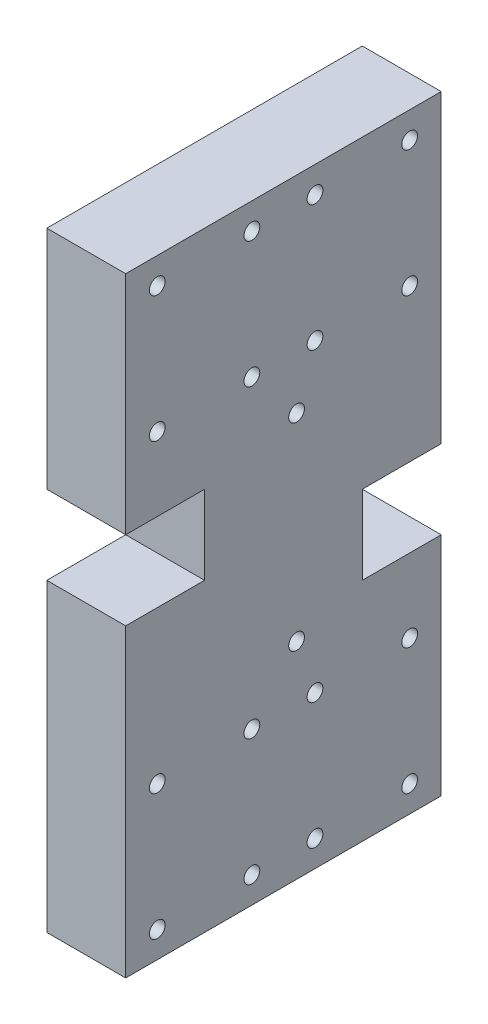
ISO-10303-21;
HEADER;
FILE_DESCRIPTION(('STEP AP214'),'2;1');
FILE_NAME('part.step','',(''),(''),'','','');
FILE_SCHEMA(('AUTOMOTIVE_DESIGN { 1 0 10303 214 1 1 1 1 }'));
ENDSEC;
DATA;
#1=APPLICATION_CONTEXT('core data for automotive mechanical design processes');
#2=APPLICATION_PROTOCOL_DEFINITION('international standard','automotive_design',2000,#1);
#3=PRODUCT_CONTEXT('',#1,'mechanical');
#4=PRODUCT('Part','Part','',(#3));
#5=PRODUCT_RELATED_PRODUCT_CATEGORY('part','',(#4));
#6=PRODUCT_DEFINITION_FORMATION('','',#4);
#7=PRODUCT_DEFINITION_CONTEXT('part definition',#1,'design');
#8=PRODUCT_DEFINITION('design','',#6,#7);
#9=PRODUCT_DEFINITION_SHAPE('','',#8);
#10=(LENGTH_UNIT() NAMED_UNIT(*) SI_UNIT(.MILLI.,.METRE.));
#11=(NAMED_UNIT(*) PLANE_ANGLE_UNIT() SI_UNIT($,.RADIAN.));
#12=(NAMED_UNIT(*) SI_UNIT($,.STERADIAN.) SOLID_ANGLE_UNIT());
#13=UNCERTAINTY_MEASURE_WITH_UNIT(LENGTH_MEASURE(1.E-05),#10,'distance_accuracy_value','');
#14=(GEOMETRIC_REPRESENTATION_CONTEXT(3) GLOBAL_UNCERTAINTY_ASSIGNED_CONTEXT((#13)) GLOBAL_UNIT_ASSIGNED_CONTEXT((#10,
#11,#12)) REPRESENTATION_CONTEXT('',''));
#15=CARTESIAN_POINT('',(0.,0.,0.));
#16=DIRECTION('',(0.,0.,1.));
#17=DIRECTION('',(1.,0.,0.));
#18=AXIS2_PLACEMENT_3D('',#15,#16,#17);
#19=CARTESIAN_POINT('',(15.,0.,-60.));
#20=DIRECTION('',(0.,0.,1.));
#21=DIRECTION('',(1.,0.,0.));
#22=AXIS2_PLACEMENT_3D('',#19,#20,#21);
#23=PLANE('',#22);
#24=DIRECTION('',(0.,1.,0.));
#25=VECTOR('',#24,1.);
#26=CARTESIAN_POINT('',(0.,0.,-60.));
#27=LINE('',#26,#25);
#28=CARTESIAN_POINT('',(0.,0.,-60.));
#29=VERTEX_POINT('',#28);
#30=CARTESIAN_POINT('',(0.,43.,-60.));
#31=VERTEX_POINT('',#30);
#32=EDGE_CURVE('E308',#29,#31,#27,.T.);
#33=ORIENTED_EDGE('',*,*,#32,.T.);
#34=DIRECTION('',(1.,0.,0.));
#35=VECTOR('',#34,1.);
#36=CARTESIAN_POINT('',(0.,43.,-60.));
#37=LINE('',#36,#35);
#38=CARTESIAN_POINT('',(15.,43.,-60.));
#39=VERTEX_POINT('',#38);
#40=EDGE_CURVE('E152',#31,#39,#37,.T.);
#41=ORIENTED_EDGE('',*,*,#40,.T.);
#42=DIRECTION('',(0.,1.,0.));
#43=VECTOR('',#42,1.);
#44=CARTESIAN_POINT('',(15.,0.,-60.));
#45=LINE('',#44,#43);
#46=CARTESIAN_POINT('',(15.,0.,-60.));
#47=VERTEX_POINT('',#46);
#48=EDGE_CURVE('E297',#47,#39,#45,.T.);
#49=ORIENTED_EDGE('',*,*,#48,.F.);
#50=DIRECTION('',(-1.,0.,0.));
#51=VECTOR('',#50,1.);
#52=CARTESIAN_POINT('',(15.,0.,-60.));
#53=LINE('',#52,#51);
#54=EDGE_CURVE('E41',#47,#29,#53,.T.);
#55=ORIENTED_EDGE('',*,*,#54,.T.);
#56=EDGE_LOOP('',(#33,#41,#49,#55));
#57=FACE_BOUND('',#56,.T.);
#58=ADVANCED_FACE('F33',(#57),#23,.F.);
#59=CARTESIAN_POINT('',(15.,0.,0.));
#60=DIRECTION('',(0.,0.,-1.));
#61=DIRECTION('',(-1.,0.,0.));
#62=AXIS2_PLACEMENT_3D('',#59,#60,#61);
#63=PLANE('',#62);
#64=DIRECTION('',(0.,-1.,0.));
#65=VECTOR('',#64,1.);
#66=CARTESIAN_POINT('',(0.,0.,0.));
#67=LINE('',#66,#65);
#68=CARTESIAN_POINT('',(0.,116.,0.));
#69=VERTEX_POINT('',#68);
#70=CARTESIAN_POINT('',(0.,73.,0.));
#71=VERTEX_POINT('',#70);
#72=EDGE_CURVE('E303',#69,#71,#67,.T.);
#73=ORIENTED_EDGE('',*,*,#72,.T.);
#74=DIRECTION('',(1.,0.,0.));
#75=VECTOR('',#74,1.);
#76=CARTESIAN_POINT('',(0.,73.,0.));
#77=LINE('',#76,#75);
#78=CARTESIAN_POINT('',(15.,73.,0.));
#79=VERTEX_POINT('',#78);
#80=EDGE_CURVE('E173',#71,#79,#77,.T.);
#81=ORIENTED_EDGE('',*,*,#80,.T.);
#82=DIRECTION('',(0.,-1.,0.));
#83=VECTOR('',#82,1.);
#84=CARTESIAN_POINT('',(15.,0.,0.));
#85=LINE('',#84,#83);
#86=CARTESIAN_POINT('',(15.,116.,0.));
#87=VERTEX_POINT('',#86);
#88=EDGE_CURVE('E290',#87,#79,#85,.T.);
#89=ORIENTED_EDGE('',*,*,#88,.F.);
#90=DIRECTION('',(-1.,0.,0.));
#91=VECTOR('',#90,1.);
#92=CARTESIAN_POINT('',(15.,116.,0.));
#93=LINE('',#92,#91);
#94=EDGE_CURVE('E302',#87,#69,#93,.T.);
#95=ORIENTED_EDGE('',*,*,#94,.T.);
#96=EDGE_LOOP('',(#73,#81,#89,#95));
#97=FACE_BOUND('',#96,.T.);
#98=ADVANCED_FACE('F348',(#97),#63,.F.);
#99=CARTESIAN_POINT('',(15.,0.,0.));
#100=DIRECTION('',(-1.,0.,0.));
#101=DIRECTION('',(0.,0.,1.));
#102=AXIS2_PLACEMENT_3D('',#99,#100,#101);
#103=PLANE('',#102);
#104=CARTESIAN_POINT('',(15.,76.8,-32.5));
#105=DIRECTION('',(1.,0.,0.));
#106=DIRECTION('',(0.,0.,-1.));
#107=AXIS2_PLACEMENT_3D('',#104,#105,#106);
#108=CIRCLE('',#107,1.5);
#109=CARTESIAN_POINT('',(15.,76.8,-34.));
#110=VERTEX_POINT('',#109);
#111=EDGE_CURVE('E188',#110,#110,#108,.T.);
#112=ORIENTED_EDGE('',*,*,#111,.F.);
#113=EDGE_LOOP('',(#112));
#114=FACE_BOUND('',#113,.T.);
#115=CARTESIAN_POINT('',(15.,111.,-54.));
#116=DIRECTION('',(1.,0.,0.));
#117=DIRECTION('',(0.,0.,1.));
#118=AXIS2_PLACEMENT_3D('',#115,#116,#117);
#119=CIRCLE('',#118,1.5);
#120=CARTESIAN_POINT('',(15.,111.,-52.5));
#121=VERTEX_POINT('',#120);
#122=EDGE_CURVE('E200',#121,#121,#119,.T.);
#123=ORIENTED_EDGE('',*,*,#122,.F.);
#124=EDGE_LOOP('',(#123));
#125=FACE_BOUND('',#124,.T.);
#126=CARTESIAN_POINT('',(15.,87.,-36.));
#127=DIRECTION('',(1.,0.,0.));
#128=DIRECTION('',(0.,0.,1.));
#129=AXIS2_PLACEMENT_3D('',#126,#127,#128);
#130=CIRCLE('',#129,1.5);
#131=CARTESIAN_POINT('',(15.,87.,-34.5));
#132=VERTEX_POINT('',#131);
#133=EDGE_CURVE('E212',#132,#132,#130,.T.);
#134=ORIENTED_EDGE('',*,*,#133,.F.);
#135=EDGE_LOOP('',(#134));
#136=FACE_BOUND('',#135,.T.);
#137=CARTESIAN_POINT('',(15.,111.,-24.));
#138=DIRECTION('',(1.,0.,0.));
#139=DIRECTION('',(0.,0.,-1.));
#140=AXIS2_PLACEMENT_3D('',#137,#138,#139);
#141=CIRCLE('',#140,1.5);
#142=CARTESIAN_POINT('',(15.,111.,-25.5));
#143=VERTEX_POINT('',#142);
#144=EDGE_CURVE('E224',#143,#143,#141,.T.);
#145=ORIENTED_EDGE('',*,*,#144,.F.);
#146=EDGE_LOOP('',(#145));
#147=FACE_BOUND('',#146,.T.);
#148=CARTESIAN_POINT('',(15.,87.,-6.));
#149=DIRECTION('',(1.,0.,0.));
#150=DIRECTION('',(0.,0.,-1.));
#151=AXIS2_PLACEMENT_3D('',#148,#149,#150);
#152=CIRCLE('',#151,1.5);
#153=CARTESIAN_POINT('',(15.,87.,-7.5));
#154=VERTEX_POINT('',#153);
#155=EDGE_CURVE('E236',#154,#154,#152,.T.);
#156=ORIENTED_EDGE('',*,*,#155,.F.);
#157=EDGE_LOOP('',(#156));
#158=FACE_BOUND('',#157,.T.);
#159=CARTESIAN_POINT('',(15.,5.,-6.));
#160=DIRECTION('',(1.,0.,0.));
#161=DIRECTION('',(0.,0.,1.));
#162=AXIS2_PLACEMENT_3D('',#159,#160,#161);
#163=CIRCLE('',#162,1.5);
#164=CARTESIAN_POINT('',(15.,5.,-4.49999999999999));
#165=VERTEX_POINT('',#164);
#166=EDGE_CURVE('E248',#165,#165,#163,.T.);
#167=ORIENTED_EDGE('',*,*,#166,.F.);
#168=EDGE_LOOP('',(#167));
#169=FACE_BOUND('',#168,.T.);
#170=CARTESIAN_POINT('',(15.,29.,-24.));
#171=DIRECTION('',(1.,0.,0.));
#172=DIRECTION('',(0.,0.,1.));
#173=AXIS2_PLACEMENT_3D('',#170,#171,#172);
#174=CIRCLE('',#173,1.5);
#175=CARTESIAN_POINT('',(15.,29.,-22.5));
#176=VERTEX_POINT('',#175);
#177=EDGE_CURVE('E260',#176,#176,#174,.T.);
#178=ORIENTED_EDGE('',*,*,#177,.F.);
#179=EDGE_LOOP('',(#178));
#180=FACE_BOUND('',#179,.T.);
#181=CARTESIAN_POINT('',(15.,29.,-36.));
#182=DIRECTION('',(1.,0.,0.));
#183=DIRECTION('',(0.,0.,-1.));
#184=AXIS2_PLACEMENT_3D('',#181,#182,#183);
#185=CIRCLE('',#184,1.5);
#186=CARTESIAN_POINT('',(15.,29.,-37.5));
#187=VERTEX_POINT('',#186);
#188=EDGE_CURVE('E272',#187,#187,#185,.T.);
#189=ORIENTED_EDGE('',*,*,#188,.F.);
#190=EDGE_LOOP('',(#189));
#191=FACE_BOUND('',#190,.T.);
#192=CARTESIAN_POINT('',(15.,5.,-54.));
#193=DIRECTION('',(1.,0.,0.));
#194=DIRECTION('',(0.,0.,-1.));
#195=AXIS2_PLACEMENT_3D('',#192,#193,#194);
#196=CIRCLE('',#195,1.5);
#197=CARTESIAN_POINT('',(15.,5.,-55.5));
#198=VERTEX_POINT('',#197);
#199=EDGE_CURVE('E284',#198,#198,#196,.T.);
#200=ORIENTED_EDGE('',*,*,#199,.F.);
#201=EDGE_LOOP('',(#200));
#202=FACE_BOUND('',#201,.T.);
#203=ORIENTED_EDGE('',*,*,#48,.T.);
#204=DIRECTION('',(0.,0.,-1.));
#205=VECTOR('',#204,1.);
#206=CARTESIAN_POINT('',(15.,43.,-60.));
#207=LINE('',#206,#205);
#208=CARTESIAN_POINT('',(15.,43.,-45.));
#209=VERTEX_POINT('',#208);
#210=EDGE_CURVE('E144',#209,#39,#207,.T.);
#211=ORIENTED_EDGE('',*,*,#210,.F.);
#212=DIRECTION('',(0.,-1.,0.));
#213=VECTOR('',#212,1.);
#214=CARTESIAN_POINT('',(15.,58.,-45.));
#215=LINE('',#214,#213);
#216=CARTESIAN_POINT('',(15.,58.,-45.));
#217=VERTEX_POINT('',#216);
#218=EDGE_CURVE('E146',#217,#209,#215,.T.);
#219=ORIENTED_EDGE('',*,*,#218,.F.);
#220=DIRECTION('',(0.,0.,1.));
#221=VECTOR('',#220,1.);
#222=CARTESIAN_POINT('',(15.,58.,-60.));
#223=LINE('',#222,#221);
#224=CARTESIAN_POINT('',(15.,58.,-60.));
#225=VERTEX_POINT('',#224);
#226=EDGE_CURVE('E124',#225,#217,#223,.T.);
#227=ORIENTED_EDGE('',*,*,#226,.F.);
#228=CARTESIAN_POINT('',(15.,116.,-60.));
#229=VERTEX_POINT('',#228);
#230=EDGE_CURVE('E296',#225,#229,#45,.T.);
#231=ORIENTED_EDGE('',*,*,#230,.T.);
#232=DIRECTION('',(0.,0.,1.));
#233=VECTOR('',#232,1.);
#234=CARTESIAN_POINT('',(15.,116.,0.));
#235=LINE('',#234,#233);
#236=EDGE_CURVE('E300',#229,#87,#235,.T.);
#237=ORIENTED_EDGE('',*,*,#236,.T.);
#238=ORIENTED_EDGE('',*,*,#88,.T.);
#239=DIRECTION('',(0.,0.,1.));
#240=VECTOR('',#239,1.);
#241=CARTESIAN_POINT('',(15.,73.,0.));
#242=LINE('',#241,#240);
#243=CARTESIAN_POINT('',(15.,73.,-15.));
#244=VERTEX_POINT('',#243);
#245=EDGE_CURVE('E160',#244,#79,#242,.T.);
#246=ORIENTED_EDGE('',*,*,#245,.F.);
#247=DIRECTION('',(0.,1.,0.));
#248=VECTOR('',#247,1.);
#249=CARTESIAN_POINT('',(15.,58.,-15.));
#250=LINE('',#249,#248);
#251=CARTESIAN_POINT('',(15.,58.,-15.));
#252=VERTEX_POINT('',#251);
#253=EDGE_CURVE('E169',#252,#244,#250,.T.);
#254=ORIENTED_EDGE('',*,*,#253,.F.);
#255=DIRECTION('',(0.,0.,-1.));
#256=VECTOR('',#255,1.);
#257=CARTESIAN_POINT('',(15.,58.,0.));
#258=LINE('',#257,#256);
#259=CARTESIAN_POINT('',(15.,58.,0.));
#260=VERTEX_POINT('',#259);
#261=EDGE_CURVE('E155',#260,#252,#258,.T.);
#262=ORIENTED_EDGE('',*,*,#261,.F.);
#263=CARTESIAN_POINT('',(15.,0.,0.));
#264=VERTEX_POINT('',#263);
#265=EDGE_CURVE('E294',#260,#264,#85,.T.);
#266=ORIENTED_EDGE('',*,*,#265,.T.);
#267=DIRECTION('',(0.,0.,-1.));
#268=VECTOR('',#267,1.);
#269=CARTESIAN_POINT('',(15.,0.,0.));
#270=LINE('',#269,#268);
#271=EDGE_CURVE('E293',#264,#47,#270,.T.);
#272=ORIENTED_EDGE('',*,*,#271,.T.);
#273=EDGE_LOOP('',(#203,#211,#219,#227,#231,#237,#238,#246,#254,#262,#266,#272));
#274=FACE_BOUND('',#273,.T.);
#275=CARTESIAN_POINT('',(15.,5.,-36.));
#276=DIRECTION('',(1.,0.,0.));
#277=DIRECTION('',(0.,0.,-1.));
#278=AXIS2_PLACEMENT_3D('',#275,#276,#277);
#279=CIRCLE('',#278,1.5);
#280=CARTESIAN_POINT('',(15.,5.,-37.5));
#281=VERTEX_POINT('',#280);
#282=EDGE_CURVE('E278',#281,#281,#279,.T.);
#283=ORIENTED_EDGE('',*,*,#282,.F.);
#284=EDGE_LOOP('',(#283));
#285=FACE_BOUND('',#284,.T.);
#286=CARTESIAN_POINT('',(15.,29.,-54.));
#287=DIRECTION('',(1.,0.,0.));
#288=DIRECTION('',(0.,0.,-1.));
#289=AXIS2_PLACEMENT_3D('',#286,#287,#288);
#290=CIRCLE('',#289,1.5);
#291=CARTESIAN_POINT('',(15.,29.,-55.5));
#292=VERTEX_POINT('',#291);
#293=EDGE_CURVE('E266',#292,#292,#290,.T.);
#294=ORIENTED_EDGE('',*,*,#293,.F.);
#295=EDGE_LOOP('',(#294));
#296=FACE_BOUND('',#295,.T.);
#297=CARTESIAN_POINT('',(15.,5.,-24.));
#298=DIRECTION('',(1.,0.,0.));
#299=DIRECTION('',(0.,0.,1.));
#300=AXIS2_PLACEMENT_3D('',#297,#298,#299);
#301=CIRCLE('',#300,1.5);
#302=CARTESIAN_POINT('',(15.,5.,-22.5));
#303=VERTEX_POINT('',#302);
#304=EDGE_CURVE('E254',#303,#303,#301,.T.);
#305=ORIENTED_EDGE('',*,*,#304,.F.);
#306=EDGE_LOOP('',(#305));
#307=FACE_BOUND('',#306,.T.);
#308=CARTESIAN_POINT('',(15.,29.,-6.));
#309=DIRECTION('',(1.,0.,0.));
#310=DIRECTION('',(0.,0.,1.));
#311=AXIS2_PLACEMENT_3D('',#308,#309,#310);
#312=CIRCLE('',#311,1.5);
#313=CARTESIAN_POINT('',(15.,29.,-4.49999999999999));
#314=VERTEX_POINT('',#313);
#315=EDGE_CURVE('E242',#314,#314,#312,.T.);
#316=ORIENTED_EDGE('',*,*,#315,.F.);
#317=EDGE_LOOP('',(#316));
#318=FACE_BOUND('',#317,.T.);
#319=CARTESIAN_POINT('',(15.,111.,-6.));
#320=DIRECTION('',(1.,0.,0.));
#321=DIRECTION('',(0.,0.,-1.));
#322=AXIS2_PLACEMENT_3D('',#319,#320,#321);
#323=CIRCLE('',#322,1.5);
#324=CARTESIAN_POINT('',(15.,111.,-7.5));
#325=VERTEX_POINT('',#324);
#326=EDGE_CURVE('E230',#325,#325,#323,.T.);
#327=ORIENTED_EDGE('',*,*,#326,.F.);
#328=EDGE_LOOP('',(#327));
#329=FACE_BOUND('',#328,.T.);
#330=CARTESIAN_POINT('',(15.,87.,-24.));
#331=DIRECTION('',(1.,0.,0.));
#332=DIRECTION('',(0.,0.,-1.));
#333=AXIS2_PLACEMENT_3D('',#330,#331,#332);
#334=CIRCLE('',#333,1.5);
#335=CARTESIAN_POINT('',(15.,87.,-25.5));
#336=VERTEX_POINT('',#335);
#337=EDGE_CURVE('E218',#336,#336,#334,.T.);
#338=ORIENTED_EDGE('',*,*,#337,.F.);
#339=EDGE_LOOP('',(#338));
#340=FACE_BOUND('',#339,.T.);
#341=CARTESIAN_POINT('',(15.,111.,-36.));
#342=DIRECTION('',(1.,0.,0.));
#343=DIRECTION('',(0.,0.,1.));
#344=AXIS2_PLACEMENT_3D('',#341,#342,#343);
#345=CIRCLE('',#344,1.5);
#346=CARTESIAN_POINT('',(15.,111.,-34.5));
#347=VERTEX_POINT('',#346);
#348=EDGE_CURVE('E206',#347,#347,#345,.T.);
#349=ORIENTED_EDGE('',*,*,#348,.F.);
#350=EDGE_LOOP('',(#349));
#351=FACE_BOUND('',#350,.T.);
#352=CARTESIAN_POINT('',(15.,87.,-54.));
#353=DIRECTION('',(1.,0.,0.));
#354=DIRECTION('',(0.,0.,1.));
#355=AXIS2_PLACEMENT_3D('',#352,#353,#354);
#356=CIRCLE('',#355,1.5);
#357=CARTESIAN_POINT('',(15.,87.,-52.5));
#358=VERTEX_POINT('',#357);
#359=EDGE_CURVE('E194',#358,#358,#356,.T.);
#360=ORIENTED_EDGE('',*,*,#359,.F.);
#361=EDGE_LOOP('',(#360));
#362=FACE_BOUND('',#361,.T.);
#363=CARTESIAN_POINT('',(15.,39.2,-32.5));
#364=DIRECTION('',(1.,0.,0.));
#365=DIRECTION('',(0.,0.,-1.));
#366=AXIS2_PLACEMENT_3D('',#363,#364,#365);
#367=CIRCLE('',#366,1.5);
#368=CARTESIAN_POINT('',(15.,39.2,-34.));
#369=VERTEX_POINT('',#368);
#370=EDGE_CURVE('E182',#369,#369,#367,.T.);
#371=ORIENTED_EDGE('',*,*,#370,.F.);
#372=EDGE_LOOP('',(#371));
#373=FACE_BOUND('',#372,.T.);
#374=ADVANCED_FACE('F330',(#114,#125,#136,#147,#158,#169,#180,#191,#202,#274,#285,#296,#307,
#318,#329,#340,#351,#362,#373),#103,.F.);
#375=CARTESIAN_POINT('',(0.,0.,0.));
#376=DIRECTION('',(-1.,0.,0.));
#377=DIRECTION('',(0.,0.,1.));
#378=AXIS2_PLACEMENT_3D('',#375,#376,#377);
#379=PLANE('',#378);
#380=DIRECTION('',(0.,0.,-1.));
#381=VECTOR('',#380,1.);
#382=CARTESIAN_POINT('',(0.,43.,-60.));
#383=LINE('',#382,#381);
#384=CARTESIAN_POINT('',(0.,43.,-45.));
#385=VERTEX_POINT('',#384);
#386=EDGE_CURVE('E137',#385,#31,#383,.T.);
#387=ORIENTED_EDGE('',*,*,#386,.T.);
#388=ORIENTED_EDGE('',*,*,#32,.F.);
#389=DIRECTION('',(0.,0.,-1.));
#390=VECTOR('',#389,1.);
#391=CARTESIAN_POINT('',(0.,0.,0.));
#392=LINE('',#391,#390);
#393=CARTESIAN_POINT('',(0.,0.,0.));
#394=VERTEX_POINT('',#393);
#395=EDGE_CURVE('E306',#394,#29,#392,.T.);
#396=ORIENTED_EDGE('',*,*,#395,.F.);
#397=CARTESIAN_POINT('',(0.,58.,0.));
#398=VERTEX_POINT('',#397);
#399=EDGE_CURVE('E287',#398,#394,#67,.T.);
#400=ORIENTED_EDGE('',*,*,#399,.F.);
#401=DIRECTION('',(0.,0.,-1.));
#402=VECTOR('',#401,1.);
#403=CARTESIAN_POINT('',(0.,58.,0.));
#404=LINE('',#403,#402);
#405=CARTESIAN_POINT('',(0.,58.,-15.));
#406=VERTEX_POINT('',#405);
#407=EDGE_CURVE('E56',#398,#406,#404,.T.);
#408=ORIENTED_EDGE('',*,*,#407,.T.);
#409=DIRECTION('',(0.,1.,0.));
#410=VECTOR('',#409,1.);
#411=CARTESIAN_POINT('',(0.,58.,-15.));
#412=LINE('',#411,#410);
#413=CARTESIAN_POINT('',(0.,73.,-15.));
#414=VERTEX_POINT('',#413);
#415=EDGE_CURVE('E159',#406,#414,#412,.T.);
#416=ORIENTED_EDGE('',*,*,#415,.T.);
#417=DIRECTION('',(0.,0.,1.));
#418=VECTOR('',#417,1.);
#419=CARTESIAN_POINT('',(0.,73.,0.));
#420=LINE('',#419,#418);
#421=EDGE_CURVE('E163',#414,#71,#420,.T.);
#422=ORIENTED_EDGE('',*,*,#421,.T.);
#423=ORIENTED_EDGE('',*,*,#72,.F.);
#424=DIRECTION('',(0.,0.,1.));
#425=VECTOR('',#424,1.);
#426=CARTESIAN_POINT('',(0.,116.,0.));
#427=LINE('',#426,#425);
#428=CARTESIAN_POINT('',(0.,116.,-60.));
#429=VERTEX_POINT('',#428);
#430=EDGE_CURVE('E311',#429,#69,#427,.T.);
#431=ORIENTED_EDGE('',*,*,#430,.F.);
#432=CARTESIAN_POINT('',(0.,58.,-60.));
#433=VERTEX_POINT('',#432);
#434=EDGE_CURVE('E143',#433,#429,#27,.T.);
#435=ORIENTED_EDGE('',*,*,#434,.F.);
#436=DIRECTION('',(0.,0.,1.));
#437=VECTOR('',#436,1.);
#438=CARTESIAN_POINT('',(0.,58.,-60.));
#439=LINE('',#438,#437);
#440=CARTESIAN_POINT('',(0.,58.,-45.));
#441=VERTEX_POINT('',#440);
#442=EDGE_CURVE('E48',#433,#441,#439,.T.);
#443=ORIENTED_EDGE('',*,*,#442,.T.);
#444=DIRECTION('',(0.,-1.,0.));
#445=VECTOR('',#444,1.);
#446=CARTESIAN_POINT('',(0.,58.,-45.));
#447=LINE('',#446,#445);
#448=EDGE_CURVE('E132',#441,#385,#447,.T.);
#449=ORIENTED_EDGE('',*,*,#448,.T.);
#450=EDGE_LOOP('',(#387,#388,#396,#400,#408,#416,#422,#423,#431,#435,#443,#449));
#451=FACE_BOUND('',#450,.T.);
#452=CARTESIAN_POINT('',(0.,76.8,-32.5));
#453=DIRECTION('',(1.,0.,0.));
#454=DIRECTION('',(0.,0.,-1.));
#455=AXIS2_PLACEMENT_3D('',#452,#453,#454);
#456=CIRCLE('',#455,1.5);
#457=CARTESIAN_POINT('',(0.,76.8,-34.));
#458=VERTEX_POINT('',#457);
#459=EDGE_CURVE('E185',#458,#458,#456,.T.);
#460=ORIENTED_EDGE('',*,*,#459,.T.);
#461=EDGE_LOOP('',(#460));
#462=FACE_BOUND('',#461,.T.);
#463=CARTESIAN_POINT('',(0.,111.,-54.));
#464=DIRECTION('',(1.,0.,0.));
#465=DIRECTION('',(0.,0.,1.));
#466=AXIS2_PLACEMENT_3D('',#463,#464,#465);
#467=CIRCLE('',#466,1.5);
#468=CARTESIAN_POINT('',(0.,111.,-52.5));
#469=VERTEX_POINT('',#468);
#470=EDGE_CURVE('E197',#469,#469,#467,.T.);
#471=ORIENTED_EDGE('',*,*,#470,.T.);
#472=EDGE_LOOP('',(#471));
#473=FACE_BOUND('',#472,.T.);
#474=CARTESIAN_POINT('',(0.,87.,-36.));
#475=DIRECTION('',(1.,0.,0.));
#476=DIRECTION('',(0.,0.,1.));
#477=AXIS2_PLACEMENT_3D('',#474,#475,#476);
#478=CIRCLE('',#477,1.5);
#479=CARTESIAN_POINT('',(0.,87.,-34.5));
#480=VERTEX_POINT('',#479);
#481=EDGE_CURVE('E209',#480,#480,#478,.T.);
#482=ORIENTED_EDGE('',*,*,#481,.T.);
#483=EDGE_LOOP('',(#482));
#484=FACE_BOUND('',#483,.T.);
#485=CARTESIAN_POINT('',(0.,111.,-24.));
#486=DIRECTION('',(1.,0.,0.));
#487=DIRECTION('',(0.,0.,-1.));
#488=AXIS2_PLACEMENT_3D('',#485,#486,#487);
#489=CIRCLE('',#488,1.5);
#490=CARTESIAN_POINT('',(0.,111.,-25.5));
#491=VERTEX_POINT('',#490);
#492=EDGE_CURVE('E221',#491,#491,#489,.T.);
#493=ORIENTED_EDGE('',*,*,#492,.T.);
#494=EDGE_LOOP('',(#493));
#495=FACE_BOUND('',#494,.T.);
#496=CARTESIAN_POINT('',(0.,87.,-6.));
#497=DIRECTION('',(1.,0.,0.));
#498=DIRECTION('',(0.,0.,-1.));
#499=AXIS2_PLACEMENT_3D('',#496,#497,#498);
#500=CIRCLE('',#499,1.5);
#501=CARTESIAN_POINT('',(0.,87.,-7.5));
#502=VERTEX_POINT('',#501);
#503=EDGE_CURVE('E233',#502,#502,#500,.T.);
#504=ORIENTED_EDGE('',*,*,#503,.T.);
#505=EDGE_LOOP('',(#504));
#506=FACE_BOUND('',#505,.T.);
#507=CARTESIAN_POINT('',(0.,5.,-6.));
#508=DIRECTION('',(1.,0.,0.));
#509=DIRECTION('',(0.,0.,1.));
#510=AXIS2_PLACEMENT_3D('',#507,#508,#509);
#511=CIRCLE('',#510,1.5);
#512=CARTESIAN_POINT('',(0.,5.,-4.49999999999999));
#513=VERTEX_POINT('',#512);
#514=EDGE_CURVE('E245',#513,#513,#511,.T.);
#515=ORIENTED_EDGE('',*,*,#514,.T.);
#516=EDGE_LOOP('',(#515));
#517=FACE_BOUND('',#516,.T.);
#518=CARTESIAN_POINT('',(0.,29.,-24.));
#519=DIRECTION('',(1.,0.,0.));
#520=DIRECTION('',(0.,0.,1.));
#521=AXIS2_PLACEMENT_3D('',#518,#519,#520);
#522=CIRCLE('',#521,1.5);
#523=CARTESIAN_POINT('',(0.,29.,-22.5));
#524=VERTEX_POINT('',#523);
#525=EDGE_CURVE('E257',#524,#524,#522,.T.);
#526=ORIENTED_EDGE('',*,*,#525,.T.);
#527=EDGE_LOOP('',(#526));
#528=FACE_BOUND('',#527,.T.);
#529=CARTESIAN_POINT('',(0.,29.,-36.));
#530=DIRECTION('',(1.,0.,0.));
#531=DIRECTION('',(0.,0.,-1.));
#532=AXIS2_PLACEMENT_3D('',#529,#530,#531);
#533=CIRCLE('',#532,1.5);
#534=CARTESIAN_POINT('',(0.,29.,-37.5));
#535=VERTEX_POINT('',#534);
#536=EDGE_CURVE('E269',#535,#535,#533,.T.);
#537=ORIENTED_EDGE('',*,*,#536,.T.);
#538=EDGE_LOOP('',(#537));
#539=FACE_BOUND('',#538,.T.);
#540=CARTESIAN_POINT('',(0.,5.,-54.));
#541=DIRECTION('',(1.,0.,0.));
#542=DIRECTION('',(0.,0.,-1.));
#543=AXIS2_PLACEMENT_3D('',#540,#541,#542);
#544=CIRCLE('',#543,1.5);
#545=CARTESIAN_POINT('',(0.,5.,-55.5));
#546=VERTEX_POINT('',#545);
#547=EDGE_CURVE('E281',#546,#546,#544,.T.);
#548=ORIENTED_EDGE('',*,*,#547,.T.);
#549=EDGE_LOOP('',(#548));
#550=FACE_BOUND('',#549,.T.);
#551=CARTESIAN_POINT('',(0.,5.,-36.));
#552=DIRECTION('',(1.,0.,0.));
#553=DIRECTION('',(0.,0.,-1.));
#554=AXIS2_PLACEMENT_3D('',#551,#552,#553);
#555=CIRCLE('',#554,1.5);
#556=CARTESIAN_POINT('',(0.,5.,-37.5));
#557=VERTEX_POINT('',#556);
#558=EDGE_CURVE('E275',#557,#557,#555,.T.);
#559=ORIENTED_EDGE('',*,*,#558,.T.);
#560=EDGE_LOOP('',(#559));
#561=FACE_BOUND('',#560,.T.);
#562=CARTESIAN_POINT('',(0.,29.,-54.));
#563=DIRECTION('',(1.,0.,0.));
#564=DIRECTION('',(0.,0.,-1.));
#565=AXIS2_PLACEMENT_3D('',#562,#563,#564);
#566=CIRCLE('',#565,1.5);
#567=CARTESIAN_POINT('',(0.,29.,-55.5));
#568=VERTEX_POINT('',#567);
#569=EDGE_CURVE('E263',#568,#568,#566,.T.);
#570=ORIENTED_EDGE('',*,*,#569,.T.);
#571=EDGE_LOOP('',(#570));
#572=FACE_BOUND('',#571,.T.);
#573=CARTESIAN_POINT('',(0.,5.,-24.));
#574=DIRECTION('',(1.,0.,0.));
#575=DIRECTION('',(0.,0.,1.));
#576=AXIS2_PLACEMENT_3D('',#573,#574,#575);
#577=CIRCLE('',#576,1.5);
#578=CARTESIAN_POINT('',(0.,5.,-22.5));
#579=VERTEX_POINT('',#578);
#580=EDGE_CURVE('E251',#579,#579,#577,.T.);
#581=ORIENTED_EDGE('',*,*,#580,.T.);
#582=EDGE_LOOP('',(#581));
#583=FACE_BOUND('',#582,.T.);
#584=CARTESIAN_POINT('',(0.,29.,-6.));
#585=DIRECTION('',(1.,0.,0.));
#586=DIRECTION('',(0.,0.,1.));
#587=AXIS2_PLACEMENT_3D('',#584,#585,#586);
#588=CIRCLE('',#587,1.5);
#589=CARTESIAN_POINT('',(0.,29.,-4.49999999999999));
#590=VERTEX_POINT('',#589);
#591=EDGE_CURVE('E239',#590,#590,#588,.T.);
#592=ORIENTED_EDGE('',*,*,#591,.T.);
#593=EDGE_LOOP('',(#592));
#594=FACE_BOUND('',#593,.T.);
#595=CARTESIAN_POINT('',(0.,111.,-6.));
#596=DIRECTION('',(1.,0.,0.));
#597=DIRECTION('',(0.,0.,-1.));
#598=AXIS2_PLACEMENT_3D('',#595,#596,#597);
#599=CIRCLE('',#598,1.5);
#600=CARTESIAN_POINT('',(0.,111.,-7.5));
#601=VERTEX_POINT('',#600);
#602=EDGE_CURVE('E227',#601,#601,#599,.T.);
#603=ORIENTED_EDGE('',*,*,#602,.T.);
#604=EDGE_LOOP('',(#603));
#605=FACE_BOUND('',#604,.T.);
#606=CARTESIAN_POINT('',(0.,87.,-24.));
#607=DIRECTION('',(1.,0.,0.));
#608=DIRECTION('',(0.,0.,-1.));
#609=AXIS2_PLACEMENT_3D('',#606,#607,#608);
#610=CIRCLE('',#609,1.5);
#611=CARTESIAN_POINT('',(0.,87.,-25.5));
#612=VERTEX_POINT('',#611);
#613=EDGE_CURVE('E215',#612,#612,#610,.T.);
#614=ORIENTED_EDGE('',*,*,#613,.T.);
#615=EDGE_LOOP('',(#614));
#616=FACE_BOUND('',#615,.T.);
#617=CARTESIAN_POINT('',(0.,111.,-36.));
#618=DIRECTION('',(1.,0.,0.));
#619=DIRECTION('',(0.,0.,1.));
#620=AXIS2_PLACEMENT_3D('',#617,#618,#619);
#621=CIRCLE('',#620,1.5);
#622=CARTESIAN_POINT('',(0.,111.,-34.5));
#623=VERTEX_POINT('',#622);
#624=EDGE_CURVE('E203',#623,#623,#621,.T.);
#625=ORIENTED_EDGE('',*,*,#624,.T.);
#626=EDGE_LOOP('',(#625));
#627=FACE_BOUND('',#626,.T.);
#628=CARTESIAN_POINT('',(0.,87.,-54.));
#629=DIRECTION('',(1.,0.,0.));
#630=DIRECTION('',(0.,0.,1.));
#631=AXIS2_PLACEMENT_3D('',#628,#629,#630);
#632=CIRCLE('',#631,1.5);
#633=CARTESIAN_POINT('',(0.,87.,-52.5));
#634=VERTEX_POINT('',#633);
#635=EDGE_CURVE('E191',#634,#634,#632,.T.);
#636=ORIENTED_EDGE('',*,*,#635,.T.);
#637=EDGE_LOOP('',(#636));
#638=FACE_BOUND('',#637,.T.);
#639=CARTESIAN_POINT('',(0.,39.2,-32.5));
#640=DIRECTION('',(1.,0.,0.));
#641=DIRECTION('',(0.,0.,-1.));
#642=AXIS2_PLACEMENT_3D('',#639,#640,#641);
#643=CIRCLE('',#642,1.5);
#644=CARTESIAN_POINT('',(0.,39.2,-34.));
#645=VERTEX_POINT('',#644);
#646=EDGE_CURVE('E176',#645,#645,#643,.T.);
#647=ORIENTED_EDGE('',*,*,#646,.T.);
#648=EDGE_LOOP('',(#647));
#649=FACE_BOUND('',#648,.T.);
#650=ADVANCED_FACE('F140',(#451,#462,#473,#484,#495,#506,#517,#528,#539,#550,#561,#572,#583,
#594,#605,#616,#627,#638,#649),#379,.T.);
#651=ORIENTED_EDGE('',*,*,#265,.F.);
#652=DIRECTION('',(1.,0.,0.));
#653=VECTOR('',#652,1.);
#654=CARTESIAN_POINT('',(0.,58.,0.));
#655=LINE('',#654,#653);
#656=EDGE_CURVE('E166',#398,#260,#655,.T.);
#657=ORIENTED_EDGE('',*,*,#656,.F.);
#658=ORIENTED_EDGE('',*,*,#399,.T.);
#659=DIRECTION('',(-1.,0.,0.));
#660=VECTOR('',#659,1.);
#661=CARTESIAN_POINT('',(15.,0.,0.));
#662=LINE('',#661,#660);
#663=EDGE_CURVE('E11',#264,#394,#662,.T.);
#664=ORIENTED_EDGE('',*,*,#663,.F.);
#665=EDGE_LOOP('',(#651,#657,#658,#664));
#666=FACE_BOUND('',#665,.T.);
#667=ADVANCED_FACE('F35',(#666),#63,.F.);
#668=CARTESIAN_POINT('',(15.,0.,0.));
#669=DIRECTION('',(0.,1.,0.));
#670=DIRECTION('',(0.,0.,1.));
#671=AXIS2_PLACEMENT_3D('',#668,#669,#670);
#672=PLANE('',#671);
#673=ORIENTED_EDGE('',*,*,#395,.T.);
#674=ORIENTED_EDGE('',*,*,#54,.F.);
#675=ORIENTED_EDGE('',*,*,#271,.F.);
#676=ORIENTED_EDGE('',*,*,#663,.T.);
#677=EDGE_LOOP('',(#673,#674,#675,#676));
#678=FACE_BOUND('',#677,.T.);
#679=ADVANCED_FACE('F335',(#678),#672,.F.);
#680=ORIENTED_EDGE('',*,*,#230,.F.);
#681=DIRECTION('',(1.,0.,0.));
#682=VECTOR('',#681,1.);
#683=CARTESIAN_POINT('',(0.,58.,-60.));
#684=LINE('',#683,#682);
#685=EDGE_CURVE('E129',#433,#225,#684,.T.);
#686=ORIENTED_EDGE('',*,*,#685,.F.);
#687=ORIENTED_EDGE('',*,*,#434,.T.);
#688=DIRECTION('',(-1.,0.,0.));
#689=VECTOR('',#688,1.);
#690=CARTESIAN_POINT('',(15.,116.,-60.));
#691=LINE('',#690,#689);
#692=EDGE_CURVE('E315',#229,#429,#691,.T.);
#693=ORIENTED_EDGE('',*,*,#692,.F.);
#694=EDGE_LOOP('',(#680,#686,#687,#693));
#695=FACE_BOUND('',#694,.T.);
#696=ADVANCED_FACE('F356',(#695),#23,.F.);
#697=CARTESIAN_POINT('',(15.,116.,0.));
#698=DIRECTION('',(0.,-1.,0.));
#699=DIRECTION('',(0.,0.,-1.));
#700=AXIS2_PLACEMENT_3D('',#697,#698,#699);
#701=PLANE('',#700);
#702=ORIENTED_EDGE('',*,*,#430,.T.);
#703=ORIENTED_EDGE('',*,*,#94,.F.);
#704=ORIENTED_EDGE('',*,*,#236,.F.);
#705=ORIENTED_EDGE('',*,*,#692,.T.);
#706=EDGE_LOOP('',(#702,#703,#704,#705));
#707=FACE_BOUND('',#706,.T.);
#708=ADVANCED_FACE('F354',(#707),#701,.F.);
#709=CARTESIAN_POINT('',(15.,5.,-54.));
#710=DIRECTION('',(-1.,0.,0.));
#711=DIRECTION('',(0.,0.,1.));
#712=AXIS2_PLACEMENT_3D('',#709,#710,#711);
#713=CYLINDRICAL_SURFACE('',#712,1.5);
#714=ORIENTED_EDGE('',*,*,#199,.T.);
#715=EDGE_LOOP('',(#714));
#716=FACE_BOUND('',#715,.T.);
#717=ORIENTED_EDGE('',*,*,#547,.F.);
#718=EDGE_LOOP('',(#717));
#719=FACE_BOUND('',#718,.T.);
#720=ADVANCED_FACE('F364',(#716,#719),#713,.F.);
#721=CARTESIAN_POINT('',(15.,5.,-36.));
#722=DIRECTION('',(-1.,0.,0.));
#723=DIRECTION('',(0.,0.,1.));
#724=AXIS2_PLACEMENT_3D('',#721,#722,#723);
#725=CYLINDRICAL_SURFACE('',#724,1.5);
#726=ORIENTED_EDGE('',*,*,#282,.T.);
#727=EDGE_LOOP('',(#726));
#728=FACE_BOUND('',#727,.T.);
#729=ORIENTED_EDGE('',*,*,#558,.F.);
#730=EDGE_LOOP('',(#729));
#731=FACE_BOUND('',#730,.T.);
#732=ADVANCED_FACE('F386',(#728,#731),#725,.F.);
#733=CARTESIAN_POINT('',(15.,29.,-36.));
#734=DIRECTION('',(-1.,0.,0.));
#735=DIRECTION('',(0.,0.,1.));
#736=AXIS2_PLACEMENT_3D('',#733,#734,#735);
#737=CYLINDRICAL_SURFACE('',#736,1.5);
#738=ORIENTED_EDGE('',*,*,#188,.T.);
#739=EDGE_LOOP('',(#738));
#740=FACE_BOUND('',#739,.T.);
#741=ORIENTED_EDGE('',*,*,#536,.F.);
#742=EDGE_LOOP('',(#741));
#743=FACE_BOUND('',#742,.T.);
#744=ADVANCED_FACE('F390',(#740,#743),#737,.F.);
#745=CARTESIAN_POINT('',(15.,29.,-54.));
#746=DIRECTION('',(-1.,0.,0.));
#747=DIRECTION('',(0.,0.,1.));
#748=AXIS2_PLACEMENT_3D('',#745,#746,#747);
#749=CYLINDRICAL_SURFACE('',#748,1.5);
#750=ORIENTED_EDGE('',*,*,#293,.T.);
#751=EDGE_LOOP('',(#750));
#752=FACE_BOUND('',#751,.T.);
#753=ORIENTED_EDGE('',*,*,#569,.F.);
#754=EDGE_LOOP('',(#753));
#755=FACE_BOUND('',#754,.T.);
#756=ADVANCED_FACE('F394',(#752,#755),#749,.F.);
#757=CARTESIAN_POINT('',(15.,29.,-24.));
#758=DIRECTION('',(-1.,0.,0.));
#759=DIRECTION('',(0.,0.,1.));
#760=AXIS2_PLACEMENT_3D('',#757,#758,#759);
#761=CYLINDRICAL_SURFACE('',#760,1.5);
#762=ORIENTED_EDGE('',*,*,#177,.T.);
#763=EDGE_LOOP('',(#762));
#764=FACE_BOUND('',#763,.T.);
#765=ORIENTED_EDGE('',*,*,#525,.F.);
#766=EDGE_LOOP('',(#765));
#767=FACE_BOUND('',#766,.T.);
#768=ADVANCED_FACE('F398',(#764,#767),#761,.F.);
#769=CARTESIAN_POINT('',(15.,5.,-24.));
#770=DIRECTION('',(-1.,0.,0.));
#771=DIRECTION('',(0.,0.,1.));
#772=AXIS2_PLACEMENT_3D('',#769,#770,#771);
#773=CYLINDRICAL_SURFACE('',#772,1.5);
#774=ORIENTED_EDGE('',*,*,#304,.T.);
#775=EDGE_LOOP('',(#774));
#776=FACE_BOUND('',#775,.T.);
#777=ORIENTED_EDGE('',*,*,#580,.F.);
#778=EDGE_LOOP('',(#777));
#779=FACE_BOUND('',#778,.T.);
#780=ADVANCED_FACE('F402',(#776,#779),#773,.F.);
#781=CARTESIAN_POINT('',(15.,5.,-6.));
#782=DIRECTION('',(-1.,0.,0.));
#783=DIRECTION('',(0.,0.,1.));
#784=AXIS2_PLACEMENT_3D('',#781,#782,#783);
#785=CYLINDRICAL_SURFACE('',#784,1.5);
#786=ORIENTED_EDGE('',*,*,#166,.T.);
#787=EDGE_LOOP('',(#786));
#788=FACE_BOUND('',#787,.T.);
#789=ORIENTED_EDGE('',*,*,#514,.F.);
#790=EDGE_LOOP('',(#789));
#791=FACE_BOUND('',#790,.T.);
#792=ADVANCED_FACE('F406',(#788,#791),#785,.F.);
#793=CARTESIAN_POINT('',(15.,29.,-6.));
#794=DIRECTION('',(-1.,0.,0.));
#795=DIRECTION('',(0.,0.,1.));
#796=AXIS2_PLACEMENT_3D('',#793,#794,#795);
#797=CYLINDRICAL_SURFACE('',#796,1.5);
#798=ORIENTED_EDGE('',*,*,#315,.T.);
#799=EDGE_LOOP('',(#798));
#800=FACE_BOUND('',#799,.T.);
#801=ORIENTED_EDGE('',*,*,#591,.F.);
#802=EDGE_LOOP('',(#801));
#803=FACE_BOUND('',#802,.T.);
#804=ADVANCED_FACE('F410',(#800,#803),#797,.F.);
#805=CARTESIAN_POINT('',(15.,87.,-6.));
#806=DIRECTION('',(-1.,0.,0.));
#807=DIRECTION('',(0.,0.,1.));
#808=AXIS2_PLACEMENT_3D('',#805,#806,#807);
#809=CYLINDRICAL_SURFACE('',#808,1.5);
#810=ORIENTED_EDGE('',*,*,#155,.T.);
#811=EDGE_LOOP('',(#810));
#812=FACE_BOUND('',#811,.T.);
#813=ORIENTED_EDGE('',*,*,#503,.F.);
#814=EDGE_LOOP('',(#813));
#815=FACE_BOUND('',#814,.T.);
#816=ADVANCED_FACE('F414',(#812,#815),#809,.F.);
#817=CARTESIAN_POINT('',(15.,111.,-6.));
#818=DIRECTION('',(-1.,0.,0.));
#819=DIRECTION('',(0.,0.,1.));
#820=AXIS2_PLACEMENT_3D('',#817,#818,#819);
#821=CYLINDRICAL_SURFACE('',#820,1.5);
#822=ORIENTED_EDGE('',*,*,#326,.T.);
#823=EDGE_LOOP('',(#822));
#824=FACE_BOUND('',#823,.T.);
#825=ORIENTED_EDGE('',*,*,#602,.F.);
#826=EDGE_LOOP('',(#825));
#827=FACE_BOUND('',#826,.T.);
#828=ADVANCED_FACE('F418',(#824,#827),#821,.F.);
#829=CARTESIAN_POINT('',(15.,111.,-24.));
#830=DIRECTION('',(-1.,0.,0.));
#831=DIRECTION('',(0.,0.,1.));
#832=AXIS2_PLACEMENT_3D('',#829,#830,#831);
#833=CYLINDRICAL_SURFACE('',#832,1.5);
#834=ORIENTED_EDGE('',*,*,#144,.T.);
#835=EDGE_LOOP('',(#834));
#836=FACE_BOUND('',#835,.T.);
#837=ORIENTED_EDGE('',*,*,#492,.F.);
#838=EDGE_LOOP('',(#837));
#839=FACE_BOUND('',#838,.T.);
#840=ADVANCED_FACE('F422',(#836,#839),#833,.F.);
#841=CARTESIAN_POINT('',(15.,87.,-24.));
#842=DIRECTION('',(-1.,0.,0.));
#843=DIRECTION('',(0.,0.,1.));
#844=AXIS2_PLACEMENT_3D('',#841,#842,#843);
#845=CYLINDRICAL_SURFACE('',#844,1.5);
#846=ORIENTED_EDGE('',*,*,#337,.T.);
#847=EDGE_LOOP('',(#846));
#848=FACE_BOUND('',#847,.T.);
#849=ORIENTED_EDGE('',*,*,#613,.F.);
#850=EDGE_LOOP('',(#849));
#851=FACE_BOUND('',#850,.T.);
#852=ADVANCED_FACE('F426',(#848,#851),#845,.F.);
#853=CARTESIAN_POINT('',(15.,87.,-36.));
#854=DIRECTION('',(-1.,0.,0.));
#855=DIRECTION('',(0.,0.,1.));
#856=AXIS2_PLACEMENT_3D('',#853,#854,#855);
#857=CYLINDRICAL_SURFACE('',#856,1.5);
#858=ORIENTED_EDGE('',*,*,#133,.T.);
#859=EDGE_LOOP('',(#858));
#860=FACE_BOUND('',#859,.T.);
#861=ORIENTED_EDGE('',*,*,#481,.F.);
#862=EDGE_LOOP('',(#861));
#863=FACE_BOUND('',#862,.T.);
#864=ADVANCED_FACE('F430',(#860,#863),#857,.F.);
#865=CARTESIAN_POINT('',(15.,111.,-36.));
#866=DIRECTION('',(-1.,0.,0.));
#867=DIRECTION('',(0.,0.,1.));
#868=AXIS2_PLACEMENT_3D('',#865,#866,#867);
#869=CYLINDRICAL_SURFACE('',#868,1.5);
#870=ORIENTED_EDGE('',*,*,#348,.T.);
#871=EDGE_LOOP('',(#870));
#872=FACE_BOUND('',#871,.T.);
#873=ORIENTED_EDGE('',*,*,#624,.F.);
#874=EDGE_LOOP('',(#873));
#875=FACE_BOUND('',#874,.T.);
#876=ADVANCED_FACE('F434',(#872,#875),#869,.F.);
#877=CARTESIAN_POINT('',(15.,111.,-54.));
#878=DIRECTION('',(-1.,0.,0.));
#879=DIRECTION('',(0.,0.,1.));
#880=AXIS2_PLACEMENT_3D('',#877,#878,#879);
#881=CYLINDRICAL_SURFACE('',#880,1.5);
#882=ORIENTED_EDGE('',*,*,#122,.T.);
#883=EDGE_LOOP('',(#882));
#884=FACE_BOUND('',#883,.T.);
#885=ORIENTED_EDGE('',*,*,#470,.F.);
#886=EDGE_LOOP('',(#885));
#887=FACE_BOUND('',#886,.T.);
#888=ADVANCED_FACE('F438',(#884,#887),#881,.F.);
#889=CARTESIAN_POINT('',(15.,87.,-54.));
#890=DIRECTION('',(-1.,0.,0.));
#891=DIRECTION('',(0.,0.,1.));
#892=AXIS2_PLACEMENT_3D('',#889,#890,#891);
#893=CYLINDRICAL_SURFACE('',#892,1.5);
#894=ORIENTED_EDGE('',*,*,#359,.T.);
#895=EDGE_LOOP('',(#894));
#896=FACE_BOUND('',#895,.T.);
#897=ORIENTED_EDGE('',*,*,#635,.F.);
#898=EDGE_LOOP('',(#897));
#899=FACE_BOUND('',#898,.T.);
#900=ADVANCED_FACE('F442',(#896,#899),#893,.F.);
#901=CARTESIAN_POINT('',(15.,76.8,-32.5));
#902=DIRECTION('',(-1.,0.,0.));
#903=DIRECTION('',(0.,0.,1.));
#904=AXIS2_PLACEMENT_3D('',#901,#902,#903);
#905=CYLINDRICAL_SURFACE('',#904,1.5);
#906=ORIENTED_EDGE('',*,*,#111,.T.);
#907=EDGE_LOOP('',(#906));
#908=FACE_BOUND('',#907,.T.);
#909=ORIENTED_EDGE('',*,*,#459,.F.);
#910=EDGE_LOOP('',(#909));
#911=FACE_BOUND('',#910,.T.);
#912=ADVANCED_FACE('F446',(#908,#911),#905,.F.);
#913=CARTESIAN_POINT('',(15.,39.2,-32.5));
#914=DIRECTION('',(-1.,0.,0.));
#915=DIRECTION('',(0.,0.,1.));
#916=AXIS2_PLACEMENT_3D('',#913,#914,#915);
#917=CYLINDRICAL_SURFACE('',#916,1.5);
#918=ORIENTED_EDGE('',*,*,#370,.T.);
#919=EDGE_LOOP('',(#918));
#920=FACE_BOUND('',#919,.T.);
#921=ORIENTED_EDGE('',*,*,#646,.F.);
#922=EDGE_LOOP('',(#921));
#923=FACE_BOUND('',#922,.T.);
#924=ADVANCED_FACE('F450',(#920,#923),#917,.F.);
#925=CARTESIAN_POINT('',(0.,73.,0.));
#926=DIRECTION('',(0.,1.,0.));
#927=DIRECTION('',(0.,0.,1.));
#928=AXIS2_PLACEMENT_3D('',#925,#926,#927);
#929=PLANE('',#928);
#930=ORIENTED_EDGE('',*,*,#245,.T.);
#931=ORIENTED_EDGE('',*,*,#80,.F.);
#932=ORIENTED_EDGE('',*,*,#421,.F.);
#933=DIRECTION('',(1.,0.,0.));
#934=VECTOR('',#933,1.);
#935=CARTESIAN_POINT('',(0.,73.,-15.));
#936=LINE('',#935,#934);
#937=EDGE_CURVE('E177',#414,#244,#936,.T.);
#938=ORIENTED_EDGE('',*,*,#937,.T.);
#939=EDGE_LOOP('',(#930,#931,#932,#938));
#940=FACE_BOUND('',#939,.T.);
#941=ADVANCED_FACE('F345',(#940),#929,.F.);
#942=CARTESIAN_POINT('',(0.,58.,-15.));
#943=DIRECTION('',(0.,0.,-1.));
#944=DIRECTION('',(-1.,0.,0.));
#945=AXIS2_PLACEMENT_3D('',#942,#943,#944);
#946=PLANE('',#945);
#947=ORIENTED_EDGE('',*,*,#253,.T.);
#948=ORIENTED_EDGE('',*,*,#937,.F.);
#949=ORIENTED_EDGE('',*,*,#415,.F.);
#950=DIRECTION('',(1.,0.,0.));
#951=VECTOR('',#950,1.);
#952=CARTESIAN_POINT('',(0.,58.,-15.));
#953=LINE('',#952,#951);
#954=EDGE_CURVE('E179',#406,#252,#953,.T.);
#955=ORIENTED_EDGE('',*,*,#954,.T.);
#956=EDGE_LOOP('',(#947,#948,#949,#955));
#957=FACE_BOUND('',#956,.T.);
#958=ADVANCED_FACE('F341',(#957),#946,.F.);
#959=CARTESIAN_POINT('',(0.,58.,0.));
#960=DIRECTION('',(0.,-1.,0.));
#961=DIRECTION('',(0.,0.,-1.));
#962=AXIS2_PLACEMENT_3D('',#959,#960,#961);
#963=PLANE('',#962);
#964=ORIENTED_EDGE('',*,*,#261,.T.);
#965=ORIENTED_EDGE('',*,*,#954,.F.);
#966=ORIENTED_EDGE('',*,*,#407,.F.);
#967=ORIENTED_EDGE('',*,*,#656,.T.);
#968=EDGE_LOOP('',(#964,#965,#966,#967));
#969=FACE_BOUND('',#968,.T.);
#970=ADVANCED_FACE('F455',(#969),#963,.F.);
#971=CARTESIAN_POINT('',(0.,43.,-60.));
#972=DIRECTION('',(0.,-1.,0.));
#973=DIRECTION('',(0.,0.,-1.));
#974=AXIS2_PLACEMENT_3D('',#971,#972,#973);
#975=PLANE('',#974);
#976=ORIENTED_EDGE('',*,*,#210,.T.);
#977=ORIENTED_EDGE('',*,*,#40,.F.);
#978=ORIENTED_EDGE('',*,*,#386,.F.);
#979=DIRECTION('',(1.,0.,0.));
#980=VECTOR('',#979,1.);
#981=CARTESIAN_POINT('',(0.,43.,-45.));
#982=LINE('',#981,#980);
#983=EDGE_CURVE('E128',#385,#209,#982,.T.);
#984=ORIENTED_EDGE('',*,*,#983,.T.);
#985=EDGE_LOOP('',(#976,#977,#978,#984));
#986=FACE_BOUND('',#985,.T.);
#987=ADVANCED_FACE('F327',(#986),#975,.F.);
#988=CARTESIAN_POINT('',(0.,58.,-45.));
#989=DIRECTION('',(0.,0.,1.));
#990=DIRECTION('',(1.,0.,0.));
#991=AXIS2_PLACEMENT_3D('',#988,#989,#990);
#992=PLANE('',#991);
#993=ORIENTED_EDGE('',*,*,#218,.T.);
#994=ORIENTED_EDGE('',*,*,#983,.F.);
#995=ORIENTED_EDGE('',*,*,#448,.F.);
#996=DIRECTION('',(1.,0.,0.));
#997=VECTOR('',#996,1.);
#998=CARTESIAN_POINT('',(0.,58.,-45.));
#999=LINE('',#998,#997);
#1000=EDGE_CURVE('E120',#441,#217,#999,.T.);
#1001=ORIENTED_EDGE('',*,*,#1000,.T.);
#1002=EDGE_LOOP('',(#993,#994,#995,#1001));
#1003=FACE_BOUND('',#1002,.T.);
#1004=ADVANCED_FACE('F133',(#1003),#992,.F.);
#1005=CARTESIAN_POINT('',(0.,58.,-60.));
#1006=DIRECTION('',(0.,1.,0.));
#1007=DIRECTION('',(0.,0.,1.));
#1008=AXIS2_PLACEMENT_3D('',#1005,#1006,#1007);
#1009=PLANE('',#1008);
#1010=ORIENTED_EDGE('',*,*,#226,.T.);
#1011=ORIENTED_EDGE('',*,*,#1000,.F.);
#1012=ORIENTED_EDGE('',*,*,#442,.F.);
#1013=ORIENTED_EDGE('',*,*,#685,.T.);
#1014=EDGE_LOOP('',(#1010,#1011,#1012,#1013));
#1015=FACE_BOUND('',#1014,.T.);
#1016=ADVANCED_FACE('F122',(#1015),#1009,.F.);
#1017=CLOSED_SHELL('',(#58,#98,#374,#650,#667,#679,#696,#708,#720,#732,#744,#756,#768,#780,#792,
#804,#816,#828,#840,#852,#864,#876,#888,#900,#912,#924,#941,#958,#970,#987,#1004,#1016));
#1018=MANIFOLD_SOLID_BREP('B2',#1017);
#1019=ADVANCED_BREP_SHAPE_REPRESENTATION('',(#18,#1018),#14);
#1020=SHAPE_DEFINITION_REPRESENTATION(#9,#1019);
ENDSEC;
END-ISO-10303-21;
